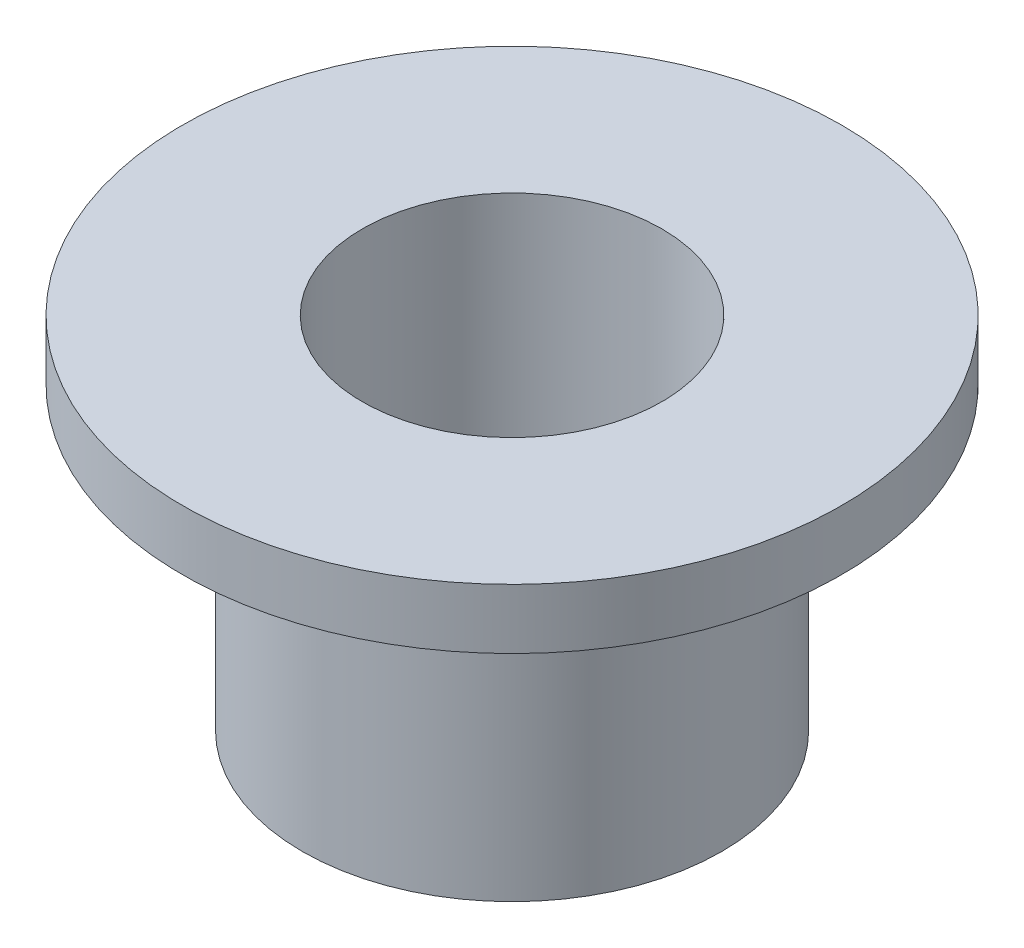
ISO-10303-21;
HEADER;
FILE_DESCRIPTION(('STEP AP214'),'2;1');
FILE_NAME('part.step','',(''),(''),'','','');
FILE_SCHEMA(('AUTOMOTIVE_DESIGN { 1 0 10303 214 1 1 1 1 }'));
ENDSEC;
DATA;
#1=APPLICATION_CONTEXT('core data for automotive mechanical design processes');
#2=APPLICATION_PROTOCOL_DEFINITION('international standard','automotive_design',2000,#1);
#3=PRODUCT_CONTEXT('',#1,'mechanical');
#4=PRODUCT('Part','Part','',(#3));
#5=PRODUCT_RELATED_PRODUCT_CATEGORY('part','',(#4));
#6=PRODUCT_DEFINITION_FORMATION('','',#4);
#7=PRODUCT_DEFINITION_CONTEXT('part definition',#1,'design');
#8=PRODUCT_DEFINITION('design','',#6,#7);
#9=PRODUCT_DEFINITION_SHAPE('','',#8);
#10=(LENGTH_UNIT() NAMED_UNIT(*) SI_UNIT(.MILLI.,.METRE.));
#11=(NAMED_UNIT(*) PLANE_ANGLE_UNIT() SI_UNIT($,.RADIAN.));
#12=(NAMED_UNIT(*) SI_UNIT($,.STERADIAN.) SOLID_ANGLE_UNIT());
#13=UNCERTAINTY_MEASURE_WITH_UNIT(LENGTH_MEASURE(1.E-05),#10,'distance_accuracy_value','');
#14=(GEOMETRIC_REPRESENTATION_CONTEXT(3) GLOBAL_UNCERTAINTY_ASSIGNED_CONTEXT((#13)) GLOBAL_UNIT_ASSIGNED_CONTEXT((#10,
#11,#12)) REPRESENTATION_CONTEXT('',''));
#15=CARTESIAN_POINT('',(0.,0.,0.));
#16=DIRECTION('',(0.,0.,1.));
#17=DIRECTION('',(1.,0.,0.));
#18=AXIS2_PLACEMENT_3D('',#15,#16,#17);
#19=CARTESIAN_POINT('',(-3.5,0.,0.));
#20=DIRECTION('',(0.,1.,0.));
#21=DIRECTION('',(0.,0.,1.));
#22=AXIS2_PLACEMENT_3D('',#19,#20,#21);
#23=PLANE('',#22);
#24=CARTESIAN_POINT('',(0.,0.,0.));
#25=DIRECTION('',(0.,-1.,0.));
#26=DIRECTION('',(0.,0.,-1.));
#27=AXIS2_PLACEMENT_3D('',#24,#25,#26);
#28=CIRCLE('',#27,2.5);
#29=CARTESIAN_POINT('',(0.,0.,-2.5));
#30=VERTEX_POINT('',#29);
#31=EDGE_CURVE('E10',#30,#30,#28,.T.);
#32=ORIENTED_EDGE('',*,*,#31,.F.);
#33=EDGE_LOOP('',(#32));
#34=FACE_BOUND('',#33,.T.);
#35=CARTESIAN_POINT('',(0.,0.,0.));
#36=DIRECTION('',(0.,-1.,0.));
#37=DIRECTION('',(0.,0.,-1.));
#38=AXIS2_PLACEMENT_3D('',#35,#36,#37);
#39=CIRCLE('',#38,3.5);
#40=CARTESIAN_POINT('',(0.,0.,-3.5));
#41=VERTEX_POINT('',#40);
#42=EDGE_CURVE('E56',#41,#41,#39,.T.);
#43=ORIENTED_EDGE('',*,*,#42,.T.);
#44=EDGE_LOOP('',(#43));
#45=FACE_BOUND('',#44,.T.);
#46=ADVANCED_FACE('F40',(#34,#45),#23,.F.);
#47=CARTESIAN_POINT('',(0.,0.,0.));
#48=DIRECTION('',(0.,-1.,0.));
#49=DIRECTION('',(0.,0.,-1.));
#50=AXIS2_PLACEMENT_3D('',#47,#48,#49);
#51=CYLINDRICAL_SURFACE('',#50,2.5);
#52=CARTESIAN_POINT('',(0.,6.,0.));
#53=DIRECTION('',(0.,-1.,0.));
#54=DIRECTION('',(0.,0.,-1.));
#55=AXIS2_PLACEMENT_3D('',#52,#53,#54);
#56=CIRCLE('',#55,2.5);
#57=CARTESIAN_POINT('',(0.,6.,-2.5));
#58=VERTEX_POINT('',#57);
#59=EDGE_CURVE('E43',#58,#58,#56,.T.);
#60=ORIENTED_EDGE('',*,*,#59,.F.);
#61=EDGE_LOOP('',(#60));
#62=FACE_BOUND('',#61,.T.);
#63=ORIENTED_EDGE('',*,*,#31,.T.);
#64=EDGE_LOOP('',(#63));
#65=FACE_BOUND('',#64,.T.);
#66=ADVANCED_FACE('F84',(#62,#65),#51,.F.);
#67=CARTESIAN_POINT('',(-2.5,6.,0.));
#68=DIRECTION('',(0.,-1.,0.));
#69=DIRECTION('',(0.,0.,-1.));
#70=AXIS2_PLACEMENT_3D('',#67,#68,#69);
#71=PLANE('',#70);
#72=CARTESIAN_POINT('',(0.,6.,0.));
#73=DIRECTION('',(0.,-1.,0.));
#74=DIRECTION('',(0.,0.,-1.));
#75=AXIS2_PLACEMENT_3D('',#72,#73,#74);
#76=CIRCLE('',#75,5.5);
#77=CARTESIAN_POINT('',(0.,6.,-5.5));
#78=VERTEX_POINT('',#77);
#79=EDGE_CURVE('E50',#78,#78,#76,.T.);
#80=ORIENTED_EDGE('',*,*,#79,.F.);
#81=EDGE_LOOP('',(#80));
#82=FACE_BOUND('',#81,.T.);
#83=ORIENTED_EDGE('',*,*,#59,.T.);
#84=EDGE_LOOP('',(#83));
#85=FACE_BOUND('',#84,.T.);
#86=ADVANCED_FACE('F80',(#82,#85),#71,.F.);
#87=CARTESIAN_POINT('',(0.,0.,0.));
#88=DIRECTION('',(0.,-1.,0.));
#89=DIRECTION('',(0.,0.,-1.));
#90=AXIS2_PLACEMENT_3D('',#87,#88,#89);
#91=CYLINDRICAL_SURFACE('',#90,5.5);
#92=CARTESIAN_POINT('',(0.,5.,0.));
#93=DIRECTION('',(0.,-1.,0.));
#94=DIRECTION('',(0.,0.,-1.));
#95=AXIS2_PLACEMENT_3D('',#92,#93,#94);
#96=CIRCLE('',#95,5.5);
#97=CARTESIAN_POINT('',(0.,5.,-5.5));
#98=VERTEX_POINT('',#97);
#99=EDGE_CURVE('E51',#98,#98,#96,.T.);
#100=ORIENTED_EDGE('',*,*,#99,.F.);
#101=EDGE_LOOP('',(#100));
#102=FACE_BOUND('',#101,.T.);
#103=ORIENTED_EDGE('',*,*,#79,.T.);
#104=EDGE_LOOP('',(#103));
#105=FACE_BOUND('',#104,.T.);
#106=ADVANCED_FACE('F73',(#102,#105),#91,.T.);
#107=CARTESIAN_POINT('',(-5.5,5.,0.));
#108=DIRECTION('',(0.,1.,0.));
#109=DIRECTION('',(0.,0.,1.));
#110=AXIS2_PLACEMENT_3D('',#107,#108,#109);
#111=PLANE('',#110);
#112=CARTESIAN_POINT('',(0.,5.,0.));
#113=DIRECTION('',(0.,-1.,0.));
#114=DIRECTION('',(0.,0.,-1.));
#115=AXIS2_PLACEMENT_3D('',#112,#113,#114);
#116=CIRCLE('',#115,3.5);
#117=CARTESIAN_POINT('',(0.,5.,-3.5));
#118=VERTEX_POINT('',#117);
#119=EDGE_CURVE('E57',#118,#118,#116,.T.);
#120=ORIENTED_EDGE('',*,*,#119,.F.);
#121=EDGE_LOOP('',(#120));
#122=FACE_BOUND('',#121,.T.);
#123=ORIENTED_EDGE('',*,*,#99,.T.);
#124=EDGE_LOOP('',(#123));
#125=FACE_BOUND('',#124,.T.);
#126=ADVANCED_FACE('F70',(#122,#125),#111,.F.);
#127=CARTESIAN_POINT('',(0.,0.,0.));
#128=DIRECTION('',(0.,-1.,0.));
#129=DIRECTION('',(0.,0.,-1.));
#130=AXIS2_PLACEMENT_3D('',#127,#128,#129);
#131=CYLINDRICAL_SURFACE('',#130,3.5);
#132=ORIENTED_EDGE('',*,*,#42,.F.);
#133=EDGE_LOOP('',(#132));
#134=FACE_BOUND('',#133,.T.);
#135=ORIENTED_EDGE('',*,*,#119,.T.);
#136=EDGE_LOOP('',(#135));
#137=FACE_BOUND('',#136,.T.);
#138=ADVANCED_FACE('F64',(#134,#137),#131,.T.);
#139=CLOSED_SHELL('',(#46,#66,#86,#106,#126,#138));
#140=MANIFOLD_SOLID_BREP('B2',#139);
#141=ADVANCED_BREP_SHAPE_REPRESENTATION('',(#18,#140),#14);
#142=SHAPE_DEFINITION_REPRESENTATION(#9,#141);
ENDSEC;
END-ISO-10303-21;
